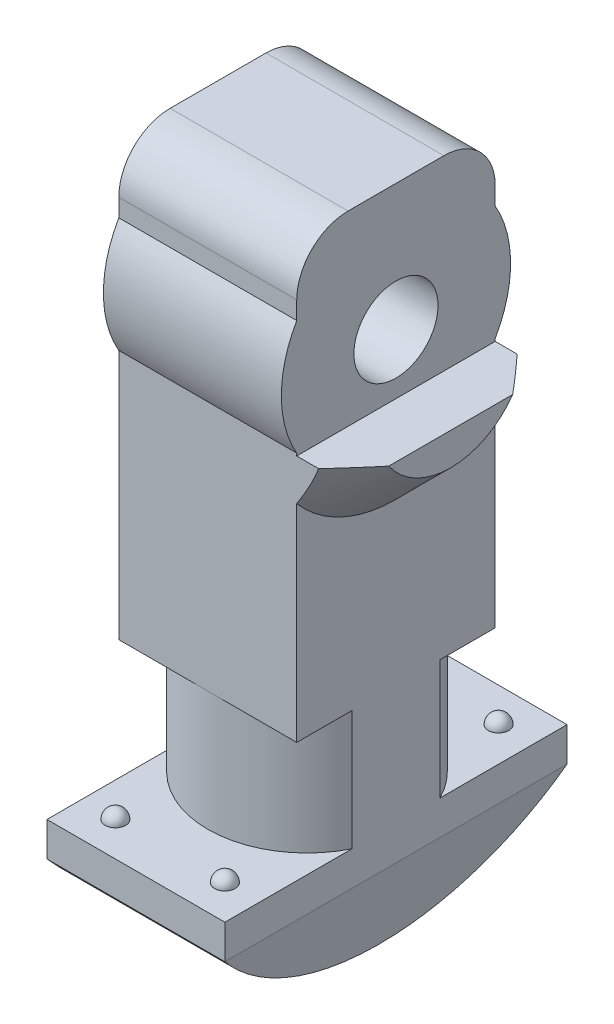
ISO-10303-21;
HEADER;
FILE_DESCRIPTION(('STEP AP214'),'2;1');
FILE_NAME('part.step','',(''),(''),'','','');
FILE_SCHEMA(('AUTOMOTIVE_DESIGN { 1 0 10303 214 1 1 1 1 }'));
ENDSEC;
DATA;
#1=APPLICATION_CONTEXT('core data for automotive mechanical design processes');
#2=APPLICATION_PROTOCOL_DEFINITION('international standard','automotive_design',2000,#1);
#3=PRODUCT_CONTEXT('',#1,'mechanical');
#4=PRODUCT('Part','Part','',(#3));
#5=PRODUCT_RELATED_PRODUCT_CATEGORY('part','',(#4));
#6=PRODUCT_DEFINITION_FORMATION('','',#4);
#7=PRODUCT_DEFINITION_CONTEXT('part definition',#1,'design');
#8=PRODUCT_DEFINITION('design','',#6,#7);
#9=PRODUCT_DEFINITION_SHAPE('','',#8);
#10=(LENGTH_UNIT() NAMED_UNIT(*) SI_UNIT(.MILLI.,.METRE.));
#11=(NAMED_UNIT(*) PLANE_ANGLE_UNIT() SI_UNIT($,.RADIAN.));
#12=(NAMED_UNIT(*) SI_UNIT($,.STERADIAN.) SOLID_ANGLE_UNIT());
#13=UNCERTAINTY_MEASURE_WITH_UNIT(LENGTH_MEASURE(1.E-05),#10,'distance_accuracy_value','');
#14=(GEOMETRIC_REPRESENTATION_CONTEXT(3) GLOBAL_UNCERTAINTY_ASSIGNED_CONTEXT((#13)) GLOBAL_UNIT_ASSIGNED_CONTEXT((#10,
#11,#12)) REPRESENTATION_CONTEXT('',''));
#15=CARTESIAN_POINT('',(0.,0.,0.));
#16=DIRECTION('',(0.,0.,1.));
#17=DIRECTION('',(1.,0.,0.));
#18=AXIS2_PLACEMENT_3D('',#15,#16,#17);
#19=CARTESIAN_POINT('',(1.6,-0.5,0.));
#20=DIRECTION('',(1.,0.,0.));
#21=DIRECTION('',(0.,0.,-1.));
#22=AXIS2_PLACEMENT_3D('',#19,#20,#21);
#23=PLANE('',#22);
#24=DIRECTION('',(0.,0.,-1.));
#25=VECTOR('',#24,1.);
#26=CARTESIAN_POINT('',(1.6,-1.75,2.9));
#27=LINE('',#26,#25);
#28=CARTESIAN_POINT('',(1.59999999999814,-1.75,-1.81038669904057));
#29=VERTEX_POINT('',#28);
#30=CARTESIAN_POINT('',(1.60000000000105,-1.75,1.81038669903704));
#31=VERTEX_POINT('',#30);
#32=EDGE_CURVE('E307',#29,#31,#27,.F.);
#33=ORIENTED_EDGE('',*,*,#32,.T.);
#34=CARTESIAN_POINT('',(1.59999999999627,-0.5,0.));
#35=DIRECTION('',(-1.,0.,0.));
#36=DIRECTION('',(0.,0.,1.));
#37=AXIS2_PLACEMENT_3D('',#34,#35,#36);
#38=CIRCLE('',#37,2.20000000001619);
#39=EDGE_CURVE('E184',#29,#31,#38,.T.);
#40=ORIENTED_EDGE('',*,*,#39,.F.);
#41=EDGE_LOOP('',(#33,#40));
#42=FACE_BOUND('',#41,.T.);
#43=ADVANCED_FACE('F17',(#42),#23,.T.);
#44=CARTESIAN_POINT('',(5.6843418860808E-11,-0.5,0.));
#45=DIRECTION('',(-1.,0.,0.));
#46=DIRECTION('',(0.,0.,1.));
#47=AXIS2_PLACEMENT_3D('',#44,#45,#46);
#48=CONICAL_SURFACE('',#47,3.79999999995562,0.785398163397448);
#49=ORIENTED_EDGE('',*,*,#39,.T.);
#50=CARTESIAN_POINT('',(1.60000000000582,-1.75,1.81038669903123));
#51=CARTESIAN_POINT('',(1.56157426157299,-1.75,1.85707569237386));
#52=CARTESIAN_POINT('',(1.52286981595263,-1.75,1.90353352595077));
#53=CARTESIAN_POINT('',(1.44498791725079,-1.75,1.99604875680543));
#54=CARTESIAN_POINT('',(1.40581047904026,-1.75,2.04210616659465));
#55=CARTESIAN_POINT('',(1.2877051179013,-1.75,2.17975922995787));
#56=CARTESIAN_POINT('',(1.20819093137459,-1.75,2.27085166421868));
#57=CARTESIAN_POINT('',(1.04805526621033,-1.75,2.45203989715457));
#58=CARTESIAN_POINT('',(0.967433883876987,-1.75,2.54213578129449));
#59=CARTESIAN_POINT('',(0.805329763908211,-1.75,2.72157806826659));
#60=CARTESIAN_POINT('',(0.723846881088129,-1.75,2.81092434006867));
#61=CARTESIAN_POINT('',(0.642073459613734,-1.75,2.9000000059577));
#62=B_SPLINE_CURVE_WITH_KNOTS('',3,(#50,#51,#52,#53,#54,#55,#56,#57,#58,#59,#60,#61),
.UNSPECIFIED.,.F.,.F.,(4,2,2,2,2,4),(0.,0.18140135202958,0.362797015545645,0.725526216056181,
1.08822406362735,1.45098404143472),.UNSPECIFIED.);
#63=CARTESIAN_POINT('',(0.64207345954515,-1.75000001399513,2.9));
#64=VERTEX_POINT('',#63);
#65=EDGE_CURVE('E174',#31,#64,#62,.T.);
#66=ORIENTED_EDGE('',*,*,#65,.T.);
#67=CARTESIAN_POINT('',(0.642073454007715,-1.75000002799116,2.90000000000525));
#68=CARTESIAN_POINT('',(0.599984711567924,-1.8562046038898,2.90000000000189));
#69=CARTESIAN_POINT('',(0.554110767961898,-1.96080716149413,2.90000000000051));
#70=CARTESIAN_POINT('',(0.456326831214628,-2.16686486208638,2.89999999999949));
#71=CARTESIAN_POINT('',(0.404431349586825,-2.26832685501984,2.89999999999986));
#72=CARTESIAN_POINT('',(0.29596392844086,-2.4685896985503,2.90000000000015));
#73=CARTESIAN_POINT('',(0.239395242508169,-2.56739233815621,2.90000000000007));
#74=CARTESIAN_POINT('',(0.122360673847673,-2.76298606038788,2.89999999999993));
#75=CARTESIAN_POINT('',(0.0618859140923312,-2.85977184905987,2.89999999999986));
#76=CARTESIAN_POINT('',(7.32122529620802E-12,-2.95560583156969,2.9));
#77=B_SPLINE_CURVE_WITH_KNOTS('',3,(#67,#68,#69,#70,#71,#72,#73,#74,#75,#76),.UNSPECIFIED.,.F.,
.F.,(4,2,2,2,4),(0.,0.34251206719025,0.684215206786466,1.02568241849751,1.36795499506267),.UNSPECIFIED.);
#78=CARTESIAN_POINT('',(3.66051245554286E-12,-2.95560583157535,2.9));
#79=VERTEX_POINT('',#78);
#80=EDGE_CURVE('E20',#64,#79,#77,.T.);
#81=ORIENTED_EDGE('',*,*,#80,.T.);
#82=CARTESIAN_POINT('',(0.,-0.5,0.));
#83=DIRECTION('',(-1.,0.,0.));
#84=DIRECTION('',(0.,0.,1.));
#85=AXIS2_PLACEMENT_3D('',#82,#83,#84);
#86=CIRCLE('',#85,3.80000000001246);
#87=CARTESIAN_POINT('',(3.65970185960833E-12,-2.95560583157535,-2.9));
#88=VERTEX_POINT('',#87);
#89=EDGE_CURVE('E449',#88,#79,#86,.T.);
#90=ORIENTED_EDGE('',*,*,#89,.F.);
#91=CARTESIAN_POINT('',(7.31948123185995E-12,-2.95560583156969,-2.9));
#92=CARTESIAN_POINT('',(0.0618859140922383,-2.85977184906014,-2.9));
#93=CARTESIAN_POINT('',(0.122360673847404,-2.76298606038837,-2.9));
#94=CARTESIAN_POINT('',(0.239395242507558,-2.56739233815718,-2.9));
#95=CARTESIAN_POINT('',(0.295963928440086,-2.46858969855153,-2.9));
#96=CARTESIAN_POINT('',(0.404431349585953,-2.26832685502164,-2.9));
#97=CARTESIAN_POINT('',(0.45632683121382,-2.1668648620885,-2.9));
#98=CARTESIAN_POINT('',(0.554110767960532,-1.96080716149658,-2.9));
#99=CARTESIAN_POINT('',(0.599984711565931,-1.85620460389224,-2.9));
#100=CARTESIAN_POINT('',(0.642073454004288,-1.75000002799323,-2.9));
#101=B_SPLINE_CURVE_WITH_KNOTS('',3,(#91,#92,#93,#94,#95,#96,#97,#98,#99,#100),.UNSPECIFIED.,
.F.,.F.,(4,2,2,2,4),(0.,0.34227257656432,0.683739788274467,1.02544292786988,1.3679549950594),.UNSPECIFIED.);
#102=CARTESIAN_POINT('',(0.642073457002216,-1.7500000139968,-2.90000000276838));
#103=VERTEX_POINT('',#102);
#104=EDGE_CURVE('E168',#88,#103,#101,.T.);
#105=ORIENTED_EDGE('',*,*,#104,.T.);
#106=CARTESIAN_POINT('',(0.642073467729757,-1.75000001399066,-2.90000001263492));
#107=CARTESIAN_POINT('',(0.723846884183607,-1.75000000501648,-2.81092434225912));
#108=CARTESIAN_POINT('',(0.805329764922005,-1.75000000134233,-2.72157806864792));
#109=CARTESIAN_POINT('',(0.967433883324425,-1.74999999865789,-2.5421357804028));
#110=CARTESIAN_POINT('',(1.04805526617255,-1.7499999996468,-2.45203989679849));
#111=CARTESIAN_POINT('',(1.20819093168117,-1.75000000035323,-2.27085166427066));
#112=CARTESIAN_POINT('',(1.28770511803715,-1.75000000007065,-2.17975922988201));
#113=CARTESIAN_POINT('',(1.40581047909078,-1.74999999996467,-2.04210616649453));
#114=CARTESIAN_POINT('',(1.44498791729852,-1.74999999998233,-1.99604875672854));
#115=CARTESIAN_POINT('',(1.5228698159923,-1.75000000001767,-1.90353352592385));
#116=CARTESIAN_POINT('',(1.56157426160741,-1.75000000003533,-1.8570756923737));
#117=CARTESIAN_POINT('',(1.60000000000582,-1.75,-1.81038669903123));
#118=B_SPLINE_CURVE_WITH_KNOTS('',3,(#106,#107,#108,#109,#110,#111,#112,#113,#114,#115,#116,
#117),.UNSPECIFIED.,.F.,.F.,(4,2,2,2,2,4),(0.,0.362759977613279,0.725457825036804,
1.08818702548592,1.26958268894484,1.45098404090442),.UNSPECIFIED.);
#119=EDGE_CURVE('E193',#103,#29,#118,.T.);
#120=ORIENTED_EDGE('',*,*,#119,.T.);
#121=EDGE_LOOP('',(#49,#66,#81,#90,#105,#120));
#122=FACE_BOUND('',#121,.T.);
#123=ADVANCED_FACE('F182',(#122),#48,.T.);
#124=CARTESIAN_POINT('',(-0.488880091841035,-15.8,-5.));
#125=DIRECTION('',(-0.978147600733807,0.207911690817753,0.));
#126=DIRECTION('',(-0.207911690817753,-0.978147600733807,0.));
#127=AXIS2_PLACEMENT_3D('',#124,#125,#126);
#128=PLANE('',#127);
#129=DIRECTION('',(0.,0.,-1.));
#130=VECTOR('',#129,1.);
#131=CARTESIAN_POINT('',(0.,-13.5,0.));
#132=LINE('',#131,#130);
#133=CARTESIAN_POINT('',(0.,-13.5,5.));
#134=VERTEX_POINT('',#133);
#135=CARTESIAN_POINT('',(0.,-13.5,-5.));
#136=VERTEX_POINT('',#135);
#137=EDGE_CURVE('E313',#134,#136,#132,.T.);
#138=ORIENTED_EDGE('',*,*,#137,.F.);
#139=CARTESIAN_POINT('',(0.910758658807827,-9.21521739130435,0.));
#140=DIRECTION('',(-0.978147600733807,0.207911690817753,0.));
#141=DIRECTION('',(0.207911690817753,0.978147600733807,0.));
#142=AXIS2_PLACEMENT_3D('',#139,#140,#141);
#143=ELLIPSE('',#142,6.73189056923081,6.58478260869566);
#144=EDGE_CURVE('E436',#136,#134,#143,.T.);
#145=ORIENTED_EDGE('',*,*,#144,.F.);
#146=EDGE_LOOP('',(#138,#145));
#147=FACE_BOUND('',#146,.T.);
#148=ADVANCED_FACE('F204',(#147),#128,.F.);
#149=CARTESIAN_POINT('',(1.6,-1.75,2.9));
#150=DIRECTION('',(0.,-1.,0.));
#151=DIRECTION('',(0.,0.,-1.));
#152=AXIS2_PLACEMENT_3D('',#149,#150,#151);
#153=PLANE('',#152);
#154=ORIENTED_EDGE('',*,*,#119,.F.);
#155=DIRECTION('',(1.,0.,0.));
#156=VECTOR('',#155,1.);
#157=CARTESIAN_POINT('',(1.6,-1.75,-2.9));
#158=LINE('',#157,#156);
#159=CARTESIAN_POINT('',(0.,-1.75,-2.9));
#160=VERTEX_POINT('',#159);
#161=EDGE_CURVE('E180',#160,#103,#158,.T.);
#162=ORIENTED_EDGE('',*,*,#161,.F.);
#163=DIRECTION('',(0.,0.,-1.));
#164=VECTOR('',#163,1.);
#165=CARTESIAN_POINT('',(0.,-1.75,0.));
#166=LINE('',#165,#164);
#167=CARTESIAN_POINT('',(0.,-1.75,2.9));
#168=VERTEX_POINT('',#167);
#169=EDGE_CURVE('E178',#168,#160,#166,.T.);
#170=ORIENTED_EDGE('',*,*,#169,.F.);
#171=DIRECTION('',(1.,0.,0.));
#172=VECTOR('',#171,1.);
#173=CARTESIAN_POINT('',(1.6,-1.75,2.9));
#174=LINE('',#173,#172);
#175=EDGE_CURVE('E159',#64,#168,#174,.F.);
#176=ORIENTED_EDGE('',*,*,#175,.F.);
#177=ORIENTED_EDGE('',*,*,#65,.F.);
#178=ORIENTED_EDGE('',*,*,#32,.F.);
#179=EDGE_LOOP('',(#154,#162,#170,#176,#177,#178));
#180=FACE_BOUND('',#179,.T.);
#181=ADVANCED_FACE('F172',(#180),#153,.F.);
#182=CARTESIAN_POINT('',(-1.,-12.5,-4.));
#183=DIRECTION('',(0.,0.,-1.));
#184=DIRECTION('',(1.,0.,0.));
#185=AXIS2_PLACEMENT_3D('',#182,#183,#184);
#186=SPHERICAL_SURFACE('',#185,0.3);
#187=CARTESIAN_POINT('',(-1.,-12.5,-4.));
#188=DIRECTION('',(0.,1.,0.));
#189=DIRECTION('',(0.,0.,-1.));
#190=AXIS2_PLACEMENT_3D('',#187,#188,#189);
#191=CIRCLE('',#190,0.3);
#192=CARTESIAN_POINT('',(-1.,-12.5,-3.7));
#193=VERTEX_POINT('',#192);
#194=CARTESIAN_POINT('',(-1.,-12.5,-4.3));
#195=VERTEX_POINT('',#194);
#196=EDGE_CURVE('E433',#193,#195,#191,.F.);
#197=ORIENTED_EDGE('',*,*,#196,.F.);
#198=CARTESIAN_POINT('',(-1.,-12.5,-4.));
#199=DIRECTION('',(0.,-1.,0.));
#200=DIRECTION('',(0.,0.,-1.));
#201=AXIS2_PLACEMENT_3D('',#198,#199,#200);
#202=CIRCLE('',#201,0.3);
#203=EDGE_CURVE('E419',#195,#193,#202,.T.);
#204=ORIENTED_EDGE('',*,*,#203,.F.);
#205=EDGE_LOOP('',(#197,#204));
#206=FACE_BOUND('',#205,.T.);
#207=ADVANCED_FACE('F317',(#206),#186,.T.);
#208=CARTESIAN_POINT('',(-5.2,-12.5,-5.));
#209=DIRECTION('',(0.,0.,-1.));
#210=DIRECTION('',(0.,1.,0.));
#211=AXIS2_PLACEMENT_3D('',#208,#209,#210);
#212=PLANE('',#211);
#213=DIRECTION('',(0.,1.,0.));
#214=VECTOR('',#213,1.);
#215=CARTESIAN_POINT('',(-5.2,-12.5,-5.));
#216=LINE('',#215,#214);
#217=CARTESIAN_POINT('',(-5.2,-13.5,-5.));
#218=VERTEX_POINT('',#217);
#219=CARTESIAN_POINT('',(-5.2,-12.5,-5.));
#220=VERTEX_POINT('',#219);
#221=EDGE_CURVE('E40',#218,#220,#216,.T.);
#222=ORIENTED_EDGE('',*,*,#221,.T.);
#223=DIRECTION('',(1.,0.,0.));
#224=VECTOR('',#223,1.);
#225=CARTESIAN_POINT('',(-5.2,-12.5,-5.));
#226=LINE('',#225,#224);
#227=CARTESIAN_POINT('',(0.,-12.5,-5.));
#228=VERTEX_POINT('',#227);
#229=EDGE_CURVE('E418',#228,#220,#226,.F.);
#230=ORIENTED_EDGE('',*,*,#229,.F.);
#231=DIRECTION('',(0.,1.,0.));
#232=VECTOR('',#231,1.);
#233=CARTESIAN_POINT('',(0.,-9.21521739130435,-5.));
#234=LINE('',#233,#232);
#235=EDGE_CURVE('E310',#136,#228,#234,.T.);
#236=ORIENTED_EDGE('',*,*,#235,.F.);
#237=DIRECTION('',(1.,0.,0.));
#238=VECTOR('',#237,1.);
#239=CARTESIAN_POINT('',(-5.2,-13.5,-5.));
#240=LINE('',#239,#238);
#241=EDGE_CURVE('E247',#218,#136,#240,.T.);
#242=ORIENTED_EDGE('',*,*,#241,.F.);
#243=EDGE_LOOP('',(#222,#230,#236,#242));
#244=FACE_BOUND('',#243,.T.);
#245=ADVANCED_FACE('F298',(#244),#212,.T.);
#246=CARTESIAN_POINT('',(-4.2,-12.5,-4.));
#247=DIRECTION('',(0.,0.,-1.));
#248=DIRECTION('',(1.,0.,0.));
#249=AXIS2_PLACEMENT_3D('',#246,#247,#248);
#250=SPHERICAL_SURFACE('',#249,0.3);
#251=CARTESIAN_POINT('',(-4.2,-12.5,-4.));
#252=DIRECTION('',(0.,1.,0.));
#253=DIRECTION('',(0.,0.,-1.));
#254=AXIS2_PLACEMENT_3D('',#251,#252,#253);
#255=CIRCLE('',#254,0.3);
#256=CARTESIAN_POINT('',(-4.2,-12.5,-3.7));
#257=VERTEX_POINT('',#256);
#258=CARTESIAN_POINT('',(-4.2,-12.5,-4.3));
#259=VERTEX_POINT('',#258);
#260=EDGE_CURVE('E430',#257,#259,#255,.F.);
#261=ORIENTED_EDGE('',*,*,#260,.F.);
#262=CARTESIAN_POINT('',(-4.2,-12.5,-4.));
#263=DIRECTION('',(0.,-1.,0.));
#264=DIRECTION('',(0.,0.,-1.));
#265=AXIS2_PLACEMENT_3D('',#262,#263,#264);
#266=CIRCLE('',#265,0.3);
#267=EDGE_CURVE('E576',#259,#257,#266,.T.);
#268=ORIENTED_EDGE('',*,*,#267,.F.);
#269=EDGE_LOOP('',(#261,#268));
#270=FACE_BOUND('',#269,.T.);
#271=ADVANCED_FACE('F293',(#270),#250,.T.);
#272=CARTESIAN_POINT('',(-2.6,-9.,0.));
#273=DIRECTION('',(0.,1.,0.));
#274=DIRECTION('',(0.,0.,1.));
#275=AXIS2_PLACEMENT_3D('',#272,#273,#274);
#276=PLANE('',#275);
#277=DIRECTION('',(0.,0.,-1.));
#278=VECTOR('',#277,1.);
#279=CARTESIAN_POINT('',(0.,-9.,0.));
#280=LINE('',#279,#278);
#281=CARTESIAN_POINT('',(0.,-9.,-1.28452325786651));
#282=VERTEX_POINT('',#281);
#283=CARTESIAN_POINT('',(0.,-9.,-2.9));
#284=VERTEX_POINT('',#283);
#285=EDGE_CURVE('E303',#282,#284,#280,.T.);
#286=ORIENTED_EDGE('',*,*,#285,.F.);
#287=CARTESIAN_POINT('',(-2.6,-9.,0.));
#288=DIRECTION('',(0.,-1.,0.));
#289=DIRECTION('',(0.,0.,-1.));
#290=AXIS2_PLACEMENT_3D('',#287,#288,#289);
#291=CIRCLE('',#290,2.9);
#292=CARTESIAN_POINT('',(-2.6,-9.,-2.9));
#293=VERTEX_POINT('',#292);
#294=EDGE_CURVE('E306',#293,#282,#291,.T.);
#295=ORIENTED_EDGE('',*,*,#294,.F.);
#296=DIRECTION('',(1.,0.,0.));
#297=VECTOR('',#296,1.);
#298=CARTESIAN_POINT('',(-5.2,-9.,-2.9));
#299=LINE('',#298,#297);
#300=EDGE_CURVE('E410',#284,#293,#299,.F.);
#301=ORIENTED_EDGE('',*,*,#300,.F.);
#302=EDGE_LOOP('',(#286,#295,#301));
#303=FACE_BOUND('',#302,.T.);
#304=ADVANCED_FACE('F289',(#303),#276,.F.);
#305=CARTESIAN_POINT('',(-2.6,-9.,0.));
#306=DIRECTION('',(0.,1.,0.));
#307=DIRECTION('',(0.,0.,1.));
#308=AXIS2_PLACEMENT_3D('',#305,#306,#307);
#309=PLANE('',#308);
#310=CARTESIAN_POINT('',(-2.6,-9.,0.));
#311=DIRECTION('',(0.,-1.,0.));
#312=DIRECTION('',(0.,0.,-1.));
#313=AXIS2_PLACEMENT_3D('',#310,#311,#312);
#314=CIRCLE('',#313,2.9);
#315=CARTESIAN_POINT('',(-5.2,-9.,-1.28452325786651));
#316=VERTEX_POINT('',#315);
#317=EDGE_CURVE('E574',#316,#293,#314,.T.);
#318=ORIENTED_EDGE('',*,*,#317,.F.);
#319=DIRECTION('',(0.,0.,1.));
#320=VECTOR('',#319,1.);
#321=CARTESIAN_POINT('',(-5.2,-9.,0.));
#322=LINE('',#321,#320);
#323=CARTESIAN_POINT('',(-5.2,-9.,-2.9));
#324=VERTEX_POINT('',#323);
#325=EDGE_CURVE('E451',#324,#316,#322,.T.);
#326=ORIENTED_EDGE('',*,*,#325,.F.);
#327=DIRECTION('',(1.,0.,0.));
#328=VECTOR('',#327,1.);
#329=CARTESIAN_POINT('',(-5.2,-9.,-2.9));
#330=LINE('',#329,#328);
#331=EDGE_CURVE('E412',#293,#324,#330,.F.);
#332=ORIENTED_EDGE('',*,*,#331,.F.);
#333=EDGE_LOOP('',(#318,#326,#332));
#334=FACE_BOUND('',#333,.T.);
#335=ADVANCED_FACE('F285',(#334),#309,.F.);
#336=CARTESIAN_POINT('',(-5.2,1.67705098312484,-2.9));
#337=DIRECTION('',(0.,0.,-1.));
#338=DIRECTION('',(0.,1.,0.));
#339=AXIS2_PLACEMENT_3D('',#336,#337,#338);
#340=PLANE('',#339);
#341=DIRECTION('',(0.,1.,0.));
#342=VECTOR('',#341,1.);
#343=CARTESIAN_POINT('',(0.,-9.21521739130435,-2.9));
#344=LINE('',#343,#342);
#345=CARTESIAN_POINT('',(0.,1.67705098312484,-2.9));
#346=VERTEX_POINT('',#345);
#347=CARTESIAN_POINT('',(0.,2.2,-2.9));
#348=VERTEX_POINT('',#347);
#349=EDGE_CURVE('E391',#346,#348,#344,.T.);
#350=ORIENTED_EDGE('',*,*,#349,.F.);
#351=DIRECTION('',(1.,0.,0.));
#352=VECTOR('',#351,1.);
#353=CARTESIAN_POINT('',(-5.2,1.67705098312484,-2.9));
#354=LINE('',#353,#352);
#355=CARTESIAN_POINT('',(-5.2,1.67705098312484,-2.9));
#356=VERTEX_POINT('',#355);
#357=EDGE_CURVE('E401',#356,#346,#354,.T.);
#358=ORIENTED_EDGE('',*,*,#357,.F.);
#359=DIRECTION('',(0.,1.,0.));
#360=VECTOR('',#359,1.);
#361=CARTESIAN_POINT('',(-5.2,1.67705098312484,-2.9));
#362=LINE('',#361,#360);
#363=CARTESIAN_POINT('',(-5.2,2.2,-2.9));
#364=VERTEX_POINT('',#363);
#365=EDGE_CURVE('E394',#356,#364,#362,.T.);
#366=ORIENTED_EDGE('',*,*,#365,.T.);
#367=DIRECTION('',(1.,0.,0.));
#368=VECTOR('',#367,1.);
#369=CARTESIAN_POINT('',(-5.2,2.2,-2.9));
#370=LINE('',#369,#368);
#371=EDGE_CURVE('E380',#348,#364,#370,.F.);
#372=ORIENTED_EDGE('',*,*,#371,.F.);
#373=EDGE_LOOP('',(#350,#358,#366,#372));
#374=FACE_BOUND('',#373,.T.);
#375=ADVANCED_FACE('F281',(#374),#340,.T.);
#376=CARTESIAN_POINT('',(-5.2,1.67705098312484,2.9));
#377=DIRECTION('',(0.,0.,1.));
#378=DIRECTION('',(1.,0.,0.));
#379=AXIS2_PLACEMENT_3D('',#376,#377,#378);
#380=PLANE('',#379);
#381=DIRECTION('',(0.,1.,0.));
#382=VECTOR('',#381,1.);
#383=CARTESIAN_POINT('',(-5.2,1.67705098312484,2.9));
#384=LINE('',#383,#382);
#385=CARTESIAN_POINT('',(-5.2,2.2,2.9));
#386=VERTEX_POINT('',#385);
#387=CARTESIAN_POINT('',(-5.2,1.67705098312484,2.9));
#388=VERTEX_POINT('',#387);
#389=EDGE_CURVE('E460',#386,#388,#384,.F.);
#390=ORIENTED_EDGE('',*,*,#389,.T.);
#391=DIRECTION('',(1.,0.,0.));
#392=VECTOR('',#391,1.);
#393=CARTESIAN_POINT('',(-5.2,1.67705098312484,2.9));
#394=LINE('',#393,#392);
#395=CARTESIAN_POINT('',(0.,1.67705098312484,2.9));
#396=VERTEX_POINT('',#395);
#397=EDGE_CURVE('E530',#396,#388,#394,.F.);
#398=ORIENTED_EDGE('',*,*,#397,.F.);
#399=DIRECTION('',(0.,1.,0.));
#400=VECTOR('',#399,1.);
#401=CARTESIAN_POINT('',(0.,-9.21521739130435,2.9));
#402=LINE('',#401,#400);
#403=CARTESIAN_POINT('',(0.,2.2,2.9));
#404=VERTEX_POINT('',#403);
#405=EDGE_CURVE('E431',#404,#396,#402,.F.);
#406=ORIENTED_EDGE('',*,*,#405,.F.);
#407=DIRECTION('',(1.,0.,0.));
#408=VECTOR('',#407,1.);
#409=CARTESIAN_POINT('',(-5.2,2.2,2.9));
#410=LINE('',#409,#408);
#411=EDGE_CURVE('E540',#386,#404,#410,.T.);
#412=ORIENTED_EDGE('',*,*,#411,.F.);
#413=EDGE_LOOP('',(#390,#398,#406,#412));
#414=FACE_BOUND('',#413,.T.);
#415=ADVANCED_FACE('F277',(#414),#380,.T.);
#416=CARTESIAN_POINT('',(-2.6,-9.,0.));
#417=DIRECTION('',(0.,1.,0.));
#418=DIRECTION('',(0.,0.,1.));
#419=AXIS2_PLACEMENT_3D('',#416,#417,#418);
#420=PLANE('',#419);
#421=CARTESIAN_POINT('',(-2.6,-9.,0.));
#422=DIRECTION('',(0.,-1.,0.));
#423=DIRECTION('',(0.,0.,-1.));
#424=AXIS2_PLACEMENT_3D('',#421,#422,#423);
#425=CIRCLE('',#424,2.9);
#426=CARTESIAN_POINT('',(0.,-9.,1.28452325786651));
#427=VERTEX_POINT('',#426);
#428=CARTESIAN_POINT('',(-2.6,-9.,2.9));
#429=VERTEX_POINT('',#428);
#430=EDGE_CURVE('E258',#427,#429,#425,.T.);
#431=ORIENTED_EDGE('',*,*,#430,.F.);
#432=DIRECTION('',(0.,0.,-1.));
#433=VECTOR('',#432,1.);
#434=CARTESIAN_POINT('',(0.,-9.,0.));
#435=LINE('',#434,#433);
#436=CARTESIAN_POINT('',(0.,-9.,2.9));
#437=VERTEX_POINT('',#436);
#438=EDGE_CURVE('E254',#437,#427,#435,.T.);
#439=ORIENTED_EDGE('',*,*,#438,.F.);
#440=DIRECTION('',(1.,0.,0.));
#441=VECTOR('',#440,1.);
#442=CARTESIAN_POINT('',(-5.2,-9.,2.9));
#443=LINE('',#442,#441);
#444=EDGE_CURVE('E259',#429,#437,#443,.T.);
#445=ORIENTED_EDGE('',*,*,#444,.F.);
#446=EDGE_LOOP('',(#431,#439,#445));
#447=FACE_BOUND('',#446,.T.);
#448=ADVANCED_FACE('F273',(#447),#420,.F.);
#449=CARTESIAN_POINT('',(-2.6,-9.,0.));
#450=DIRECTION('',(0.,1.,0.));
#451=DIRECTION('',(0.,0.,1.));
#452=AXIS2_PLACEMENT_3D('',#449,#450,#451);
#453=PLANE('',#452);
#454=DIRECTION('',(1.,0.,0.));
#455=VECTOR('',#454,1.);
#456=CARTESIAN_POINT('',(-5.2,-9.,2.9));
#457=LINE('',#456,#455);
#458=CARTESIAN_POINT('',(-5.2,-9.,2.9));
#459=VERTEX_POINT('',#458);
#460=EDGE_CURVE('E533',#459,#429,#457,.T.);
#461=ORIENTED_EDGE('',*,*,#460,.F.);
#462=DIRECTION('',(0.,0.,1.));
#463=VECTOR('',#462,1.);
#464=CARTESIAN_POINT('',(-5.2,-9.,0.));
#465=LINE('',#464,#463);
#466=CARTESIAN_POINT('',(-5.2,-9.,1.28452325786651));
#467=VERTEX_POINT('',#466);
#468=EDGE_CURVE('E262',#467,#459,#465,.T.);
#469=ORIENTED_EDGE('',*,*,#468,.F.);
#470=CARTESIAN_POINT('',(-2.6,-9.,0.));
#471=DIRECTION('',(0.,-1.,0.));
#472=DIRECTION('',(0.,0.,-1.));
#473=AXIS2_PLACEMENT_3D('',#470,#471,#472);
#474=CIRCLE('',#473,2.9);
#475=EDGE_CURVE('E565',#429,#467,#474,.T.);
#476=ORIENTED_EDGE('',*,*,#475,.F.);
#477=EDGE_LOOP('',(#461,#469,#476));
#478=FACE_BOUND('',#477,.T.);
#479=ADVANCED_FACE('F269',(#478),#453,.F.);
#480=CARTESIAN_POINT('',(-1.,-12.5,4.));
#481=DIRECTION('',(0.,0.,-1.));
#482=DIRECTION('',(1.,0.,0.));
#483=AXIS2_PLACEMENT_3D('',#480,#481,#482);
#484=SPHERICAL_SURFACE('',#483,0.3);
#485=CARTESIAN_POINT('',(-1.,-12.5,4.));
#486=DIRECTION('',(0.,1.,0.));
#487=DIRECTION('',(0.,0.,-1.));
#488=AXIS2_PLACEMENT_3D('',#485,#486,#487);
#489=CIRCLE('',#488,0.3);
#490=CARTESIAN_POINT('',(-1.,-12.5,4.3));
#491=VERTEX_POINT('',#490);
#492=CARTESIAN_POINT('',(-1.,-12.5,3.7));
#493=VERTEX_POINT('',#492);
#494=EDGE_CURVE('E563',#491,#493,#489,.F.);
#495=ORIENTED_EDGE('',*,*,#494,.F.);
#496=CARTESIAN_POINT('',(-1.,-12.5,4.));
#497=DIRECTION('',(0.,-1.,0.));
#498=DIRECTION('',(0.,0.,-1.));
#499=AXIS2_PLACEMENT_3D('',#496,#497,#498);
#500=CIRCLE('',#499,0.3);
#501=EDGE_CURVE('E517',#493,#491,#500,.T.);
#502=ORIENTED_EDGE('',*,*,#501,.F.);
#503=EDGE_LOOP('',(#495,#502));
#504=FACE_BOUND('',#503,.T.);
#505=ADVANCED_FACE('F265',(#504),#484,.T.);
#506=CARTESIAN_POINT('',(0.,-9.21521739130435,0.));
#507=DIRECTION('',(1.,0.,0.));
#508=DIRECTION('',(0.,0.,-1.));
#509=AXIS2_PLACEMENT_3D('',#506,#507,#508);
#510=PLANE('',#509);
#511=DIRECTION('',(0.,0.,1.));
#512=VECTOR('',#511,1.);
#513=CARTESIAN_POINT('',(0.,-12.5,2.9));
#514=LINE('',#513,#512);
#515=CARTESIAN_POINT('',(0.,-12.5,5.));
#516=VERTEX_POINT('',#515);
#517=CARTESIAN_POINT('',(0.,-12.5,1.28452325786651));
#518=VERTEX_POINT('',#517);
#519=EDGE_CURVE('E514',#516,#518,#514,.F.);
#520=ORIENTED_EDGE('',*,*,#519,.F.);
#521=DIRECTION('',(0.,-1.,0.));
#522=VECTOR('',#521,1.);
#523=CARTESIAN_POINT('',(0.,-12.5,5.));
#524=LINE('',#523,#522);
#525=EDGE_CURVE('E251',#134,#516,#524,.F.);
#526=ORIENTED_EDGE('',*,*,#525,.F.);
#527=ORIENTED_EDGE('',*,*,#137,.T.);
#528=ORIENTED_EDGE('',*,*,#235,.T.);
#529=DIRECTION('',(0.,0.,1.));
#530=VECTOR('',#529,1.);
#531=CARTESIAN_POINT('',(0.,-12.5,-5.));
#532=LINE('',#531,#530);
#533=CARTESIAN_POINT('',(0.,-12.5,-1.28452325786651));
#534=VERTEX_POINT('',#533);
#535=EDGE_CURVE('E415',#534,#228,#532,.F.);
#536=ORIENTED_EDGE('',*,*,#535,.F.);
#537=DIRECTION('',(0.,1.,0.));
#538=VECTOR('',#537,1.);
#539=CARTESIAN_POINT('',(0.,-9.21521739130435,-1.28452325786651));
#540=LINE('',#539,#538);
#541=EDGE_CURVE('E308',#534,#282,#540,.T.);
#542=ORIENTED_EDGE('',*,*,#541,.T.);
#543=ORIENTED_EDGE('',*,*,#285,.T.);
#544=DIRECTION('',(0.,1.,0.));
#545=VECTOR('',#544,1.);
#546=CARTESIAN_POINT('',(0.,-12.5,-2.9));
#547=LINE('',#546,#545);
#548=EDGE_CURVE('E407',#88,#284,#547,.F.);
#549=ORIENTED_EDGE('',*,*,#548,.F.);
#550=ORIENTED_EDGE('',*,*,#89,.T.);
#551=DIRECTION('',(0.,1.,0.));
#552=VECTOR('',#551,1.);
#553=CARTESIAN_POINT('',(0.,-12.5,2.9));
#554=LINE('',#553,#552);
#555=EDGE_CURVE('E163',#437,#79,#554,.T.);
#556=ORIENTED_EDGE('',*,*,#555,.F.);
#557=ORIENTED_EDGE('',*,*,#438,.T.);
#558=DIRECTION('',(0.,-1.,0.));
#559=VECTOR('',#558,1.);
#560=CARTESIAN_POINT('',(0.,-9.,1.28452325786651));
#561=LINE('',#560,#559);
#562=EDGE_CURVE('E255',#518,#427,#561,.F.);
#563=ORIENTED_EDGE('',*,*,#562,.F.);
#564=EDGE_LOOP('',(#520,#526,#527,#528,#536,#542,#543,#549,#550,#556,#557,#563));
#565=FACE_BOUND('',#564,.T.);
#566=ADVANCED_FACE('F268',(#565),#510,.T.);
#567=CARTESIAN_POINT('',(-5.2,-12.5,5.));
#568=DIRECTION('',(0.,0.,1.));
#569=DIRECTION('',(0.,-1.,0.));
#570=AXIS2_PLACEMENT_3D('',#567,#568,#569);
#571=PLANE('',#570);
#572=DIRECTION('',(0.,-1.,0.));
#573=VECTOR('',#572,1.);
#574=CARTESIAN_POINT('',(-5.2,-12.5,5.));
#575=LINE('',#574,#573);
#576=CARTESIAN_POINT('',(-5.2,-12.5,5.));
#577=VERTEX_POINT('',#576);
#578=CARTESIAN_POINT('',(-5.2,-13.5,5.));
#579=VERTEX_POINT('',#578);
#580=EDGE_CURVE('E249',#577,#579,#575,.T.);
#581=ORIENTED_EDGE('',*,*,#580,.T.);
#582=DIRECTION('',(1.,0.,0.));
#583=VECTOR('',#582,1.);
#584=CARTESIAN_POINT('',(-5.2,-13.5,5.));
#585=LINE('',#584,#583);
#586=EDGE_CURVE('E434',#134,#579,#585,.F.);
#587=ORIENTED_EDGE('',*,*,#586,.F.);
#588=ORIENTED_EDGE('',*,*,#525,.T.);
#589=DIRECTION('',(1.,0.,0.));
#590=VECTOR('',#589,1.);
#591=CARTESIAN_POINT('',(-5.2,-12.5,5.));
#592=LINE('',#591,#590);
#593=EDGE_CURVE('E524',#577,#516,#592,.T.);
#594=ORIENTED_EDGE('',*,*,#593,.F.);
#595=EDGE_LOOP('',(#581,#587,#588,#594));
#596=FACE_BOUND('',#595,.T.);
#597=ADVANCED_FACE('F241',(#596),#571,.T.);
#598=CARTESIAN_POINT('',(-4.2,-12.5,4.));
#599=DIRECTION('',(0.,0.,-1.));
#600=DIRECTION('',(1.,0.,0.));
#601=AXIS2_PLACEMENT_3D('',#598,#599,#600);
#602=SPHERICAL_SURFACE('',#601,0.3);
#603=CARTESIAN_POINT('',(-4.2,-12.5,4.));
#604=DIRECTION('',(0.,1.,0.));
#605=DIRECTION('',(0.,0.,-1.));
#606=AXIS2_PLACEMENT_3D('',#603,#604,#605);
#607=CIRCLE('',#606,0.3);
#608=CARTESIAN_POINT('',(-4.2,-12.5,4.3));
#609=VERTEX_POINT('',#608);
#610=CARTESIAN_POINT('',(-4.2,-12.5,3.7));
#611=VERTEX_POINT('',#610);
#612=EDGE_CURVE('E527',#609,#611,#607,.F.);
#613=ORIENTED_EDGE('',*,*,#612,.F.);
#614=CARTESIAN_POINT('',(-4.2,-12.5,4.));
#615=DIRECTION('',(0.,-1.,0.));
#616=DIRECTION('',(0.,0.,-1.));
#617=AXIS2_PLACEMENT_3D('',#614,#615,#616);
#618=CIRCLE('',#617,0.3);
#619=EDGE_CURVE('E558',#611,#609,#618,.T.);
#620=ORIENTED_EDGE('',*,*,#619,.F.);
#621=EDGE_LOOP('',(#613,#620));
#622=FACE_BOUND('',#621,.T.);
#623=ADVANCED_FACE('F236',(#622),#602,.T.);
#624=CARTESIAN_POINT('',(-5.2,-9.21521739130435,0.));
#625=DIRECTION('',(1.,0.,0.));
#626=DIRECTION('',(0.,0.,-1.));
#627=AXIS2_PLACEMENT_3D('',#624,#625,#626);
#628=CYLINDRICAL_SURFACE('',#627,6.58478260869566);
#629=ORIENTED_EDGE('',*,*,#586,.T.);
#630=CARTESIAN_POINT('',(-6.11075865880783,-9.21521739130435,0.));
#631=DIRECTION('',(0.978147600733807,0.207911690817753,0.));
#632=DIRECTION('',(0.207911690817753,-0.978147600733807,0.));
#633=AXIS2_PLACEMENT_3D('',#630,#631,#632);
#634=ELLIPSE('',#633,6.73189056923081,6.58478260869566);
#635=EDGE_CURVE('E556',#579,#218,#634,.T.);
#636=ORIENTED_EDGE('',*,*,#635,.T.);
#637=ORIENTED_EDGE('',*,*,#241,.T.);
#638=ORIENTED_EDGE('',*,*,#144,.T.);
#639=EDGE_LOOP('',(#629,#636,#637,#638));
#640=FACE_BOUND('',#639,.T.);
#641=ADVANCED_FACE('F232',(#640),#628,.T.);
#642=CARTESIAN_POINT('',(0.,-9.21521739130435,0.));
#643=DIRECTION('',(1.,0.,0.));
#644=DIRECTION('',(0.,0.,-1.));
#645=AXIS2_PLACEMENT_3D('',#642,#643,#644);
#646=PLANE('',#645);
#647=CARTESIAN_POINT('',(0.,0.,0.));
#648=DIRECTION('',(1.,0.,0.));
#649=DIRECTION('',(0.,0.,-1.));
#650=AXIS2_PLACEMENT_3D('',#647,#648,#649);
#651=CIRCLE('',#650,1.22949999999999);
#652=CARTESIAN_POINT('',(0.,0.,-1.22949999999999));
#653=VERTEX_POINT('',#652);
#654=EDGE_CURVE('E427',#653,#653,#651,.F.);
#655=ORIENTED_EDGE('',*,*,#654,.T.);
#656=EDGE_LOOP('',(#655));
#657=FACE_BOUND('',#656,.T.);
#658=CARTESIAN_POINT('',(0.,0.,0.));
#659=DIRECTION('',(1.,0.,0.));
#660=DIRECTION('',(0.,0.,-1.));
#661=AXIS2_PLACEMENT_3D('',#658,#659,#660);
#662=CIRCLE('',#661,3.35);
#663=CARTESIAN_POINT('',(0.,-1.67705098312484,2.9));
#664=VERTEX_POINT('',#663);
#665=EDGE_CURVE('E537',#664,#396,#662,.F.);
#666=ORIENTED_EDGE('',*,*,#665,.F.);
#667=DIRECTION('',(0.,1.,0.));
#668=VECTOR('',#667,1.);
#669=CARTESIAN_POINT('',(0.,-12.5,2.9));
#670=LINE('',#669,#668);
#671=EDGE_CURVE('E529',#168,#664,#670,.T.);
#672=ORIENTED_EDGE('',*,*,#671,.F.);
#673=ORIENTED_EDGE('',*,*,#169,.T.);
#674=DIRECTION('',(0.,1.,0.));
#675=VECTOR('',#674,1.);
#676=CARTESIAN_POINT('',(0.,-12.5,-2.9));
#677=LINE('',#676,#675);
#678=CARTESIAN_POINT('',(0.,-1.67705098312484,-2.9));
#679=VERTEX_POINT('',#678);
#680=EDGE_CURVE('E406',#679,#160,#677,.F.);
#681=ORIENTED_EDGE('',*,*,#680,.F.);
#682=CARTESIAN_POINT('',(0.,0.,0.));
#683=DIRECTION('',(1.,0.,0.));
#684=DIRECTION('',(0.,0.,-1.));
#685=AXIS2_PLACEMENT_3D('',#682,#683,#684);
#686=CIRCLE('',#685,3.35);
#687=EDGE_CURVE('E386',#346,#679,#686,.F.);
#688=ORIENTED_EDGE('',*,*,#687,.F.);
#689=ORIENTED_EDGE('',*,*,#349,.T.);
#690=CARTESIAN_POINT('',(0.,2.2,-1.4));
#691=DIRECTION('',(1.,0.,0.));
#692=DIRECTION('',(0.,0.,-1.));
#693=AXIS2_PLACEMENT_3D('',#690,#691,#692);
#694=CIRCLE('',#693,1.5);
#695=CARTESIAN_POINT('',(0.,3.7,-1.4));
#696=VERTEX_POINT('',#695);
#697=EDGE_CURVE('E376',#696,#348,#694,.F.);
#698=ORIENTED_EDGE('',*,*,#697,.F.);
#699=DIRECTION('',(0.,0.,1.));
#700=VECTOR('',#699,1.);
#701=CARTESIAN_POINT('',(0.,3.7,-2.9));
#702=LINE('',#701,#700);
#703=CARTESIAN_POINT('',(0.,3.7,1.4));
#704=VERTEX_POINT('',#703);
#705=EDGE_CURVE('E395',#704,#696,#702,.F.);
#706=ORIENTED_EDGE('',*,*,#705,.F.);
#707=CARTESIAN_POINT('',(0.,2.2,1.4));
#708=DIRECTION('',(1.,0.,0.));
#709=DIRECTION('',(0.,0.,-1.));
#710=AXIS2_PLACEMENT_3D('',#707,#708,#709);
#711=CIRCLE('',#710,1.5);
#712=EDGE_CURVE('E539',#404,#704,#711,.F.);
#713=ORIENTED_EDGE('',*,*,#712,.F.);
#714=ORIENTED_EDGE('',*,*,#405,.T.);
#715=EDGE_LOOP('',(#666,#672,#673,#681,#688,#689,#698,#706,#713,#714));
#716=FACE_BOUND('',#715,.T.);
#717=ADVANCED_FACE('F228',(#657,#716),#646,.T.);
#718=CARTESIAN_POINT('',(-5.2,-12.5,-5.));
#719=DIRECTION('',(0.,1.,0.));
#720=DIRECTION('',(0.,0.,1.));
#721=AXIS2_PLACEMENT_3D('',#718,#719,#720);
#722=PLANE('',#721);
#723=ORIENTED_EDGE('',*,*,#260,.T.);
#724=ORIENTED_EDGE('',*,*,#267,.T.);
#725=EDGE_LOOP('',(#723,#724));
#726=FACE_BOUND('',#725,.T.);
#727=CARTESIAN_POINT('',(-2.6,-12.5,0.));
#728=DIRECTION('',(0.,-1.,0.));
#729=DIRECTION('',(0.,0.,-1.));
#730=AXIS2_PLACEMENT_3D('',#727,#728,#729);
#731=CIRCLE('',#730,2.9);
#732=CARTESIAN_POINT('',(-5.2,-12.5,-1.28452325786651));
#733=VERTEX_POINT('',#732);
#734=EDGE_CURVE('E411',#534,#733,#731,.F.);
#735=ORIENTED_EDGE('',*,*,#734,.F.);
#736=ORIENTED_EDGE('',*,*,#535,.T.);
#737=ORIENTED_EDGE('',*,*,#229,.T.);
#738=DIRECTION('',(0.,0.,-1.));
#739=VECTOR('',#738,1.);
#740=CARTESIAN_POINT('',(-5.2,-12.5,0.));
#741=LINE('',#740,#739);
#742=EDGE_CURVE('E424',#220,#733,#741,.F.);
#743=ORIENTED_EDGE('',*,*,#742,.T.);
#744=EDGE_LOOP('',(#735,#736,#737,#743));
#745=FACE_BOUND('',#744,.T.);
#746=ORIENTED_EDGE('',*,*,#196,.T.);
#747=ORIENTED_EDGE('',*,*,#203,.T.);
#748=EDGE_LOOP('',(#746,#747));
#749=FACE_BOUND('',#748,.T.);
#750=ADVANCED_FACE('F224',(#726,#745,#749),#722,.T.);
#751=CARTESIAN_POINT('',(-2.6,-9.,0.));
#752=DIRECTION('',(0.,-1.,0.));
#753=DIRECTION('',(0.,0.,-1.));
#754=AXIS2_PLACEMENT_3D('',#751,#752,#753);
#755=CYLINDRICAL_SURFACE('',#754,2.9);
#756=ORIENTED_EDGE('',*,*,#734,.T.);
#757=DIRECTION('',(0.,1.,0.));
#758=VECTOR('',#757,1.);
#759=CARTESIAN_POINT('',(-5.2,-9.21521739130435,-1.28452325786651));
#760=LINE('',#759,#758);
#761=EDGE_CURVE('E420',#733,#316,#760,.T.);
#762=ORIENTED_EDGE('',*,*,#761,.T.);
#763=ORIENTED_EDGE('',*,*,#317,.T.);
#764=ORIENTED_EDGE('',*,*,#294,.T.);
#765=ORIENTED_EDGE('',*,*,#541,.F.);
#766=EDGE_LOOP('',(#756,#762,#763,#764,#765));
#767=FACE_BOUND('',#766,.T.);
#768=ADVANCED_FACE('F219',(#767),#755,.T.);
#769=CARTESIAN_POINT('',(-5.2,-12.5,-2.9));
#770=DIRECTION('',(0.,0.,-1.));
#771=DIRECTION('',(0.,1.,0.));
#772=AXIS2_PLACEMENT_3D('',#769,#770,#771);
#773=PLANE('',#772);
#774=DIRECTION('',(1.,0.,0.));
#775=VECTOR('',#774,1.);
#776=CARTESIAN_POINT('',(-5.2,-1.67705098312484,-2.9));
#777=LINE('',#776,#775);
#778=CARTESIAN_POINT('',(-5.2,-1.67705098312484,-2.9));
#779=VERTEX_POINT('',#778);
#780=EDGE_CURVE('E403',#679,#779,#777,.F.);
#781=ORIENTED_EDGE('',*,*,#780,.F.);
#782=ORIENTED_EDGE('',*,*,#680,.T.);
#783=ORIENTED_EDGE('',*,*,#161,.T.);
#784=ORIENTED_EDGE('',*,*,#104,.F.);
#785=ORIENTED_EDGE('',*,*,#548,.T.);
#786=ORIENTED_EDGE('',*,*,#300,.T.);
#787=ORIENTED_EDGE('',*,*,#331,.T.);
#788=DIRECTION('',(0.,1.,0.));
#789=VECTOR('',#788,1.);
#790=CARTESIAN_POINT('',(-5.2,-9.21521739130435,-2.9));
#791=LINE('',#790,#789);
#792=EDGE_CURVE('E423',#324,#779,#791,.T.);
#793=ORIENTED_EDGE('',*,*,#792,.T.);
#794=EDGE_LOOP('',(#781,#782,#783,#784,#785,#786,#787,#793));
#795=FACE_BOUND('',#794,.T.);
#796=ADVANCED_FACE('F213',(#795),#773,.T.);
#797=CARTESIAN_POINT('',(-5.2,0.,0.));
#798=DIRECTION('',(1.,0.,0.));
#799=DIRECTION('',(0.,0.,-1.));
#800=AXIS2_PLACEMENT_3D('',#797,#798,#799);
#801=CYLINDRICAL_SURFACE('',#800,3.35);
#802=ORIENTED_EDGE('',*,*,#357,.T.);
#803=ORIENTED_EDGE('',*,*,#687,.T.);
#804=ORIENTED_EDGE('',*,*,#780,.T.);
#805=CARTESIAN_POINT('',(-5.2,0.,0.));
#806=DIRECTION('',(1.,0.,0.));
#807=DIRECTION('',(0.,0.,-1.));
#808=AXIS2_PLACEMENT_3D('',#805,#806,#807);
#809=CIRCLE('',#808,3.35);
#810=EDGE_CURVE('E501',#779,#356,#809,.T.);
#811=ORIENTED_EDGE('',*,*,#810,.T.);
#812=EDGE_LOOP('',(#802,#803,#804,#811));
#813=FACE_BOUND('',#812,.T.);
#814=ADVANCED_FACE('F218',(#813),#801,.T.);
#815=CARTESIAN_POINT('',(-5.2,2.2,-1.4));
#816=DIRECTION('',(1.,0.,0.));
#817=DIRECTION('',(0.,0.,-1.));
#818=AXIS2_PLACEMENT_3D('',#815,#816,#817);
#819=CYLINDRICAL_SURFACE('',#818,1.5);
#820=ORIENTED_EDGE('',*,*,#697,.T.);
#821=ORIENTED_EDGE('',*,*,#371,.T.);
#822=CARTESIAN_POINT('',(-5.2,2.2,-1.4));
#823=DIRECTION('',(1.,0.,0.));
#824=DIRECTION('',(0.,0.,-1.));
#825=AXIS2_PLACEMENT_3D('',#822,#823,#824);
#826=CIRCLE('',#825,1.5);
#827=CARTESIAN_POINT('',(-5.2,3.7,-1.4));
#828=VERTEX_POINT('',#827);
#829=EDGE_CURVE('E504',#364,#828,#826,.T.);
#830=ORIENTED_EDGE('',*,*,#829,.T.);
#831=DIRECTION('',(1.,0.,0.));
#832=VECTOR('',#831,1.);
#833=CARTESIAN_POINT('',(-5.2,3.7,-1.4));
#834=LINE('',#833,#832);
#835=EDGE_CURVE('E383',#696,#828,#834,.F.);
#836=ORIENTED_EDGE('',*,*,#835,.F.);
#837=EDGE_LOOP('',(#820,#821,#830,#836));
#838=FACE_BOUND('',#837,.T.);
#839=ADVANCED_FACE('F364',(#838),#819,.T.);
#840=CARTESIAN_POINT('',(-5.2,3.7,-2.9));
#841=DIRECTION('',(0.,1.,0.));
#842=DIRECTION('',(0.,0.,1.));
#843=AXIS2_PLACEMENT_3D('',#840,#841,#842);
#844=PLANE('',#843);
#845=ORIENTED_EDGE('',*,*,#705,.T.);
#846=ORIENTED_EDGE('',*,*,#835,.T.);
#847=DIRECTION('',(0.,0.,-1.));
#848=VECTOR('',#847,1.);
#849=CARTESIAN_POINT('',(-5.2,3.7,0.));
#850=LINE('',#849,#848);
#851=CARTESIAN_POINT('',(-5.2,3.7,1.4));
#852=VERTEX_POINT('',#851);
#853=EDGE_CURVE('E509',#828,#852,#850,.F.);
#854=ORIENTED_EDGE('',*,*,#853,.T.);
#855=DIRECTION('',(1.,0.,0.));
#856=VECTOR('',#855,1.);
#857=CARTESIAN_POINT('',(-5.2,3.7,1.4));
#858=LINE('',#857,#856);
#859=EDGE_CURVE('E538',#704,#852,#858,.F.);
#860=ORIENTED_EDGE('',*,*,#859,.F.);
#861=EDGE_LOOP('',(#845,#846,#854,#860));
#862=FACE_BOUND('',#861,.T.);
#863=ADVANCED_FACE('F361',(#862),#844,.T.);
#864=CARTESIAN_POINT('',(-5.2,2.2,1.4));
#865=DIRECTION('',(1.,0.,0.));
#866=DIRECTION('',(0.,0.,-1.));
#867=AXIS2_PLACEMENT_3D('',#864,#865,#866);
#868=CYLINDRICAL_SURFACE('',#867,1.5);
#869=ORIENTED_EDGE('',*,*,#712,.T.);
#870=ORIENTED_EDGE('',*,*,#859,.T.);
#871=CARTESIAN_POINT('',(-5.2,2.2,1.4));
#872=DIRECTION('',(1.,0.,0.));
#873=DIRECTION('',(0.,0.,-1.));
#874=AXIS2_PLACEMENT_3D('',#871,#872,#873);
#875=CIRCLE('',#874,1.5);
#876=EDGE_CURVE('E549',#852,#386,#875,.T.);
#877=ORIENTED_EDGE('',*,*,#876,.T.);
#878=ORIENTED_EDGE('',*,*,#411,.T.);
#879=EDGE_LOOP('',(#869,#870,#877,#878));
#880=FACE_BOUND('',#879,.T.);
#881=ADVANCED_FACE('F357',(#880),#868,.T.);
#882=CARTESIAN_POINT('',(-5.2,0.,0.));
#883=DIRECTION('',(1.,0.,0.));
#884=DIRECTION('',(0.,0.,-1.));
#885=AXIS2_PLACEMENT_3D('',#882,#883,#884);
#886=CYLINDRICAL_SURFACE('',#885,3.35);
#887=CARTESIAN_POINT('',(-5.2,0.,0.));
#888=DIRECTION('',(1.,0.,0.));
#889=DIRECTION('',(0.,0.,-1.));
#890=AXIS2_PLACEMENT_3D('',#887,#888,#889);
#891=CIRCLE('',#890,3.35);
#892=CARTESIAN_POINT('',(-5.2,-1.67705098312484,2.9));
#893=VERTEX_POINT('',#892);
#894=EDGE_CURVE('E605',#388,#893,#891,.T.);
#895=ORIENTED_EDGE('',*,*,#894,.T.);
#896=DIRECTION('',(1.,0.,0.));
#897=VECTOR('',#896,1.);
#898=CARTESIAN_POINT('',(-5.2,-1.67705098312484,2.9));
#899=LINE('',#898,#897);
#900=EDGE_CURVE('E531',#664,#893,#899,.F.);
#901=ORIENTED_EDGE('',*,*,#900,.F.);
#902=ORIENTED_EDGE('',*,*,#665,.T.);
#903=ORIENTED_EDGE('',*,*,#397,.T.);
#904=EDGE_LOOP('',(#895,#901,#902,#903));
#905=FACE_BOUND('',#904,.T.);
#906=ADVANCED_FACE('F354',(#905),#886,.T.);
#907=CARTESIAN_POINT('',(-5.2,-12.5,2.9));
#908=DIRECTION('',(0.,0.,1.));
#909=DIRECTION('',(1.,0.,0.));
#910=AXIS2_PLACEMENT_3D('',#907,#908,#909);
#911=PLANE('',#910);
#912=ORIENTED_EDGE('',*,*,#460,.T.);
#913=ORIENTED_EDGE('',*,*,#444,.T.);
#914=ORIENTED_EDGE('',*,*,#555,.T.);
#915=ORIENTED_EDGE('',*,*,#80,.F.);
#916=ORIENTED_EDGE('',*,*,#175,.T.);
#917=ORIENTED_EDGE('',*,*,#671,.T.);
#918=ORIENTED_EDGE('',*,*,#900,.T.);
#919=DIRECTION('',(0.,1.,0.));
#920=VECTOR('',#919,1.);
#921=CARTESIAN_POINT('',(-5.2,-9.21521739130435,2.9));
#922=LINE('',#921,#920);
#923=EDGE_CURVE('E521',#893,#459,#922,.F.);
#924=ORIENTED_EDGE('',*,*,#923,.T.);
#925=EDGE_LOOP('',(#912,#913,#914,#915,#916,#917,#918,#924));
#926=FACE_BOUND('',#925,.T.);
#927=ADVANCED_FACE('F158',(#926),#911,.T.);
#928=CARTESIAN_POINT('',(-2.6,-9.,0.));
#929=DIRECTION('',(0.,-1.,0.));
#930=DIRECTION('',(0.,0.,-1.));
#931=AXIS2_PLACEMENT_3D('',#928,#929,#930);
#932=CYLINDRICAL_SURFACE('',#931,2.9);
#933=ORIENTED_EDGE('',*,*,#475,.T.);
#934=DIRECTION('',(0.,1.,0.));
#935=VECTOR('',#934,1.);
#936=CARTESIAN_POINT('',(-5.2,-9.21521739130435,1.28452325786651));
#937=LINE('',#936,#935);
#938=CARTESIAN_POINT('',(-5.2,-12.5,1.28452325786651));
#939=VERTEX_POINT('',#938);
#940=EDGE_CURVE('E518',#467,#939,#937,.F.);
#941=ORIENTED_EDGE('',*,*,#940,.T.);
#942=CARTESIAN_POINT('',(-2.6,-12.5,0.));
#943=DIRECTION('',(0.,-1.,0.));
#944=DIRECTION('',(0.,0.,-1.));
#945=AXIS2_PLACEMENT_3D('',#942,#943,#944);
#946=CIRCLE('',#945,2.9);
#947=EDGE_CURVE('E516',#518,#939,#946,.T.);
#948=ORIENTED_EDGE('',*,*,#947,.F.);
#949=ORIENTED_EDGE('',*,*,#562,.T.);
#950=ORIENTED_EDGE('',*,*,#430,.T.);
#951=EDGE_LOOP('',(#933,#941,#948,#949,#950));
#952=FACE_BOUND('',#951,.T.);
#953=ADVANCED_FACE('F347',(#952),#932,.T.);
#954=CARTESIAN_POINT('',(-5.2,-12.5,2.9));
#955=DIRECTION('',(0.,1.,0.));
#956=DIRECTION('',(0.,0.,1.));
#957=AXIS2_PLACEMENT_3D('',#954,#955,#956);
#958=PLANE('',#957);
#959=ORIENTED_EDGE('',*,*,#612,.T.);
#960=ORIENTED_EDGE('',*,*,#619,.T.);
#961=EDGE_LOOP('',(#959,#960));
#962=FACE_BOUND('',#961,.T.);
#963=DIRECTION('',(0.,0.,-1.));
#964=VECTOR('',#963,1.);
#965=CARTESIAN_POINT('',(-5.2,-12.5,0.));
#966=LINE('',#965,#964);
#967=EDGE_CURVE('E513',#939,#577,#966,.F.);
#968=ORIENTED_EDGE('',*,*,#967,.T.);
#969=ORIENTED_EDGE('',*,*,#593,.T.);
#970=ORIENTED_EDGE('',*,*,#519,.T.);
#971=ORIENTED_EDGE('',*,*,#947,.T.);
#972=EDGE_LOOP('',(#968,#969,#970,#971));
#973=FACE_BOUND('',#972,.T.);
#974=ORIENTED_EDGE('',*,*,#494,.T.);
#975=ORIENTED_EDGE('',*,*,#501,.T.);
#976=EDGE_LOOP('',(#974,#975));
#977=FACE_BOUND('',#976,.T.);
#978=ADVANCED_FACE('F343',(#962,#973,#977),#958,.T.);
#979=CARTESIAN_POINT('',(-5.2,-13.5,-5.));
#980=DIRECTION('',(0.978147600733807,0.207911690817753,0.));
#981=DIRECTION('',(-0.207911690817753,0.978147600733807,0.));
#982=AXIS2_PLACEMENT_3D('',#979,#980,#981);
#983=PLANE('',#982);
#984=DIRECTION('',(0.,0.,-1.));
#985=VECTOR('',#984,1.);
#986=CARTESIAN_POINT('',(-5.2,-13.5,0.));
#987=LINE('',#986,#985);
#988=EDGE_CURVE('E31',#579,#218,#987,.T.);
#989=ORIENTED_EDGE('',*,*,#988,.T.);
#990=ORIENTED_EDGE('',*,*,#635,.F.);
#991=EDGE_LOOP('',(#989,#990));
#992=FACE_BOUND('',#991,.T.);
#993=ADVANCED_FACE('F336',(#992),#983,.F.);
#994=CARTESIAN_POINT('',(0.,0.,0.));
#995=DIRECTION('',(1.,0.,0.));
#996=DIRECTION('',(0.,0.,-1.));
#997=AXIS2_PLACEMENT_3D('',#994,#995,#996);
#998=CYLINDRICAL_SURFACE('',#997,1.22949999999999);
#999=CARTESIAN_POINT('',(-5.2,0.,0.));
#1000=DIRECTION('',(1.,0.,0.));
#1001=DIRECTION('',(0.,0.,-1.));
#1002=AXIS2_PLACEMENT_3D('',#999,#1000,#1001);
#1003=CIRCLE('',#1002,1.22949999999999);
#1004=CARTESIAN_POINT('',(-5.2,0.,-1.22949999999999));
#1005=VERTEX_POINT('',#1004);
#1006=EDGE_CURVE('E11',#1005,#1005,#1003,.F.);
#1007=ORIENTED_EDGE('',*,*,#1006,.T.);
#1008=EDGE_LOOP('',(#1007));
#1009=FACE_BOUND('',#1008,.T.);
#1010=ORIENTED_EDGE('',*,*,#654,.F.);
#1011=EDGE_LOOP('',(#1010));
#1012=FACE_BOUND('',#1011,.T.);
#1013=ADVANCED_FACE('F329',(#1009,#1012),#998,.F.);
#1014=CARTESIAN_POINT('',(-5.2,-9.21521739130435,0.));
#1015=DIRECTION('',(1.,0.,0.));
#1016=DIRECTION('',(0.,0.,-1.));
#1017=AXIS2_PLACEMENT_3D('',#1014,#1015,#1016);
#1018=PLANE('',#1017);
#1019=ORIENTED_EDGE('',*,*,#1006,.F.);
#1020=EDGE_LOOP('',(#1019));
#1021=FACE_BOUND('',#1020,.T.);
#1022=ORIENTED_EDGE('',*,*,#988,.F.);
#1023=ORIENTED_EDGE('',*,*,#580,.F.);
#1024=ORIENTED_EDGE('',*,*,#967,.F.);
#1025=ORIENTED_EDGE('',*,*,#940,.F.);
#1026=ORIENTED_EDGE('',*,*,#468,.T.);
#1027=ORIENTED_EDGE('',*,*,#923,.F.);
#1028=ORIENTED_EDGE('',*,*,#894,.F.);
#1029=ORIENTED_EDGE('',*,*,#389,.F.);
#1030=ORIENTED_EDGE('',*,*,#876,.F.);
#1031=ORIENTED_EDGE('',*,*,#853,.F.);
#1032=ORIENTED_EDGE('',*,*,#829,.F.);
#1033=ORIENTED_EDGE('',*,*,#365,.F.);
#1034=ORIENTED_EDGE('',*,*,#810,.F.);
#1035=ORIENTED_EDGE('',*,*,#792,.F.);
#1036=ORIENTED_EDGE('',*,*,#325,.T.);
#1037=ORIENTED_EDGE('',*,*,#761,.F.);
#1038=ORIENTED_EDGE('',*,*,#742,.F.);
#1039=ORIENTED_EDGE('',*,*,#221,.F.);
#1040=EDGE_LOOP('',(#1022,#1023,#1024,#1025,#1026,#1027,#1028,#1029,#1030,#1031,#1032,#1033,
#1034,#1035,#1036,#1037,#1038,#1039));
#1041=FACE_BOUND('',#1040,.T.);
#1042=ADVANCED_FACE('F327',(#1021,#1041),#1018,.F.);
#1043=CLOSED_SHELL('',(#43,#123,#148,#181,#207,#245,#271,#304,#335,#375,#415,#448,#479,#505,
#566,#597,#623,#641,#717,#750,#768,#796,#814,#839,#863,#881,#906,#927,#953,#978,#993,#1013,#1042));
#1044=MANIFOLD_SOLID_BREP('B1',#1043);
#1045=ADVANCED_BREP_SHAPE_REPRESENTATION('',(#18,#1044),#14);
#1046=SHAPE_DEFINITION_REPRESENTATION(#9,#1045);
ENDSEC;
END-ISO-10303-21;
